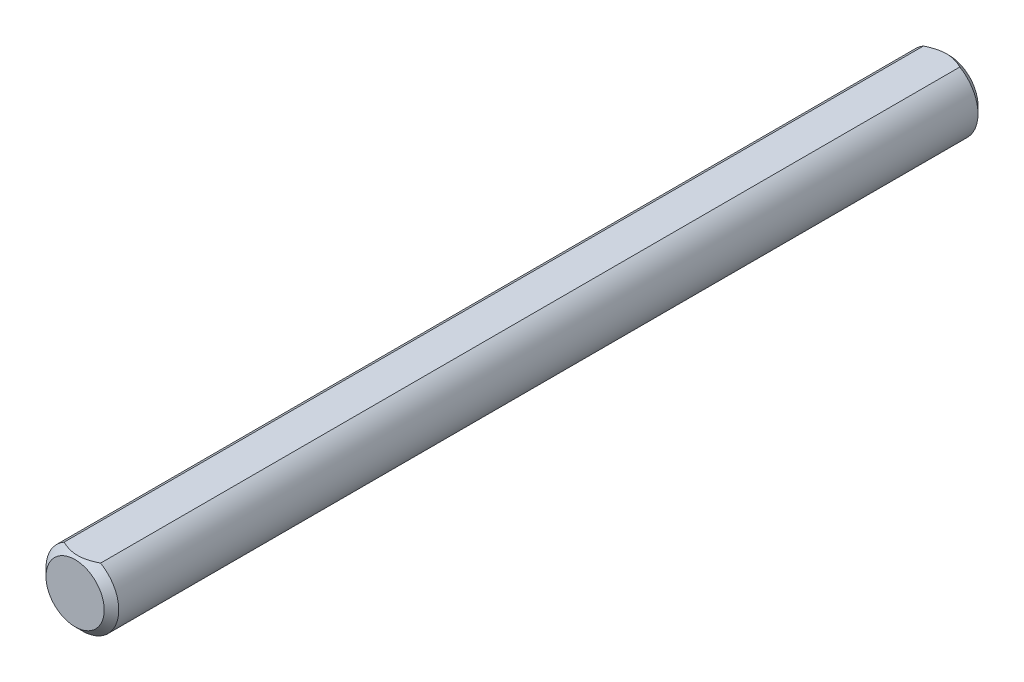
ISO-10303-21;
HEADER;
FILE_DESCRIPTION(('STEP AP214'),'2;1');
FILE_NAME('part.step','',(''),(''),'','','');
FILE_SCHEMA(('AUTOMOTIVE_DESIGN { 1 0 10303 214 1 1 1 1 }'));
ENDSEC;
DATA;
#1=APPLICATION_CONTEXT('core data for automotive mechanical design processes');
#2=APPLICATION_PROTOCOL_DEFINITION('international standard','automotive_design',2000,#1);
#3=PRODUCT_CONTEXT('',#1,'mechanical');
#4=PRODUCT('Part','Part','',(#3));
#5=PRODUCT_RELATED_PRODUCT_CATEGORY('part','',(#4));
#6=PRODUCT_DEFINITION_FORMATION('','',#4);
#7=PRODUCT_DEFINITION_CONTEXT('part definition',#1,'design');
#8=PRODUCT_DEFINITION('design','',#6,#7);
#9=PRODUCT_DEFINITION_SHAPE('','',#8);
#10=(LENGTH_UNIT() NAMED_UNIT(*) SI_UNIT(.MILLI.,.METRE.));
#11=(NAMED_UNIT(*) PLANE_ANGLE_UNIT() SI_UNIT($,.RADIAN.));
#12=(NAMED_UNIT(*) SI_UNIT($,.STERADIAN.) SOLID_ANGLE_UNIT());
#13=UNCERTAINTY_MEASURE_WITH_UNIT(LENGTH_MEASURE(1.E-05),#10,'distance_accuracy_value','');
#14=(GEOMETRIC_REPRESENTATION_CONTEXT(3) GLOBAL_UNCERTAINTY_ASSIGNED_CONTEXT((#13)) GLOBAL_UNIT_ASSIGNED_CONTEXT((#10,
#11,#12)) REPRESENTATION_CONTEXT('',''));
#15=CARTESIAN_POINT('',(0.,0.,0.));
#16=DIRECTION('',(0.,0.,1.));
#17=DIRECTION('',(1.,0.,0.));
#18=AXIS2_PLACEMENT_3D('',#15,#16,#17);
#19=CARTESIAN_POINT('',(0.,0.,76.2));
#20=DIRECTION('',(0.,0.,-1.));
#21=DIRECTION('',(-1.,0.,0.));
#22=AXIS2_PLACEMENT_3D('',#19,#20,#21);
#23=CYLINDRICAL_SURFACE('',#22,6.35);
#24=CARTESIAN_POINT('',(0.,0.,74.93));
#25=DIRECTION('',(0.,0.,1.));
#26=DIRECTION('',(1.,0.,0.));
#27=AXIS2_PLACEMENT_3D('',#24,#25,#26);
#28=CIRCLE('',#27,6.35);
#29=CARTESIAN_POINT('',(3.175,5.49926131403118,74.93));
#30=VERTEX_POINT('',#29);
#31=CARTESIAN_POINT('',(-3.175,5.49926131403118,74.93));
#32=VERTEX_POINT('',#31);
#33=EDGE_CURVE('E74',#30,#32,#28,.F.);
#34=ORIENTED_EDGE('',*,*,#33,.T.);
#35=DIRECTION('',(0.,0.,1.));
#36=VECTOR('',#35,1.);
#37=CARTESIAN_POINT('',(-3.175,5.49926131403118,-76.2));
#38=LINE('',#37,#36);
#39=CARTESIAN_POINT('',(-3.175,5.49926131403118,-74.9299999999999));
#40=VERTEX_POINT('',#39);
#41=EDGE_CURVE('E52',#40,#32,#38,.T.);
#42=ORIENTED_EDGE('',*,*,#41,.F.);
#43=CARTESIAN_POINT('',(0.,0.,-74.9299999999999));
#44=DIRECTION('',(0.,0.,1.));
#45=DIRECTION('',(1.,0.,0.));
#46=AXIS2_PLACEMENT_3D('',#43,#44,#45);
#47=CIRCLE('',#46,6.35);
#48=CARTESIAN_POINT('',(3.175,5.49926131403118,-74.9299999999999));
#49=VERTEX_POINT('',#48);
#50=EDGE_CURVE('E73',#40,#49,#47,.T.);
#51=ORIENTED_EDGE('',*,*,#50,.T.);
#52=DIRECTION('',(0.,0.,1.));
#53=VECTOR('',#52,1.);
#54=CARTESIAN_POINT('',(3.175,5.49926131403118,-76.2));
#55=LINE('',#54,#53);
#56=EDGE_CURVE('E62',#49,#30,#55,.T.);
#57=ORIENTED_EDGE('',*,*,#56,.T.);
#58=EDGE_LOOP('',(#34,#42,#51,#57));
#59=FACE_BOUND('',#58,.T.);
#60=ADVANCED_FACE('F32',(#59),#23,.T.);
#61=CARTESIAN_POINT('',(0.,0.,76.2));
#62=DIRECTION('',(0.,0.,1.));
#63=DIRECTION('',(1.,0.,0.));
#64=AXIS2_PLACEMENT_3D('',#61,#62,#63);
#65=PLANE('',#64);
#66=CARTESIAN_POINT('',(0.,0.,76.2));
#67=DIRECTION('',(0.,0.,1.));
#68=DIRECTION('',(1.,0.,0.));
#69=AXIS2_PLACEMENT_3D('',#66,#67,#68);
#70=CIRCLE('',#69,5.08000000000004);
#71=CARTESIAN_POINT('',(5.08000000000004,0.,76.2));
#72=VERTEX_POINT('',#71);
#73=EDGE_CURVE('E46',#72,#72,#70,.T.);
#74=ORIENTED_EDGE('',*,*,#73,.T.);
#75=EDGE_LOOP('',(#74));
#76=FACE_BOUND('',#75,.T.);
#77=ADVANCED_FACE('F84',(#76),#65,.T.);
#78=CARTESIAN_POINT('',(0.,0.,-76.2));
#79=DIRECTION('',(0.,0.,1.));
#80=DIRECTION('',(1.,0.,0.));
#81=AXIS2_PLACEMENT_3D('',#78,#79,#80);
#82=PLANE('',#81);
#83=CARTESIAN_POINT('',(0.,0.,-76.2));
#84=DIRECTION('',(0.,0.,1.));
#85=DIRECTION('',(1.,0.,0.));
#86=AXIS2_PLACEMENT_3D('',#83,#84,#85);
#87=CIRCLE('',#86,5.07999999999988);
#88=CARTESIAN_POINT('',(5.07999999999988,0.,-76.2));
#89=VERTEX_POINT('',#88);
#90=EDGE_CURVE('E76',#89,#89,#87,.F.);
#91=ORIENTED_EDGE('',*,*,#90,.T.);
#92=EDGE_LOOP('',(#91));
#93=FACE_BOUND('',#92,.T.);
#94=ADVANCED_FACE('F92',(#93),#82,.F.);
#95=CARTESIAN_POINT('',(0.,0.,-74.9299999999999));
#96=DIRECTION('',(0.,0.,1.));
#97=DIRECTION('',(1.,0.,0.));
#98=AXIS2_PLACEMENT_3D('',#95,#96,#97);
#99=CONICAL_SURFACE('',#98,6.35,0.785398163397445);
#100=CARTESIAN_POINT('',(-6.45792270447453,5.49926131403118,-72.7978634379674));
#101=CARTESIAN_POINT('',(-6.30123299115944,5.49926131403118,-72.9171330488199));
#102=CARTESIAN_POINT('',(-6.14368019310392,5.49926131403118,-73.0352869639139));
#103=CARTESIAN_POINT('',(-5.82650261129757,5.49926131403118,-73.2688594353726));
#104=CARTESIAN_POINT('',(-5.66687732996834,5.49926131403118,-73.3842773153237));
#105=CARTESIAN_POINT('',(-5.34404125721356,5.49926131403118,-73.6126950953359));
#106=CARTESIAN_POINT('',(-5.18081227996582,5.49926131403118,-73.7256693781113));
#107=CARTESIAN_POINT('',(-4.85160623188593,5.49926131403118,-73.9475270296315));
#108=CARTESIAN_POINT('',(-4.68562935411628,5.49926131403118,-74.0564106840339));
#109=CARTESIAN_POINT('',(-4.34045504917425,5.49926131403118,-74.2755311755331));
#110=CARTESIAN_POINT('',(-4.16106068889063,5.49926131403118,-74.3854593569187));
#111=CARTESIAN_POINT('',(-3.7980720381419,5.49926131403118,-74.5982637689522));
#112=CARTESIAN_POINT('',(-3.61447707081218,5.49926131403118,-74.7011388522732));
#113=CARTESIAN_POINT('',(-3.24307520421854,5.49926131403118,-74.8976296093296));
#114=CARTESIAN_POINT('',(-3.05528281776388,5.49926131403118,-74.9912725000992));
#115=CARTESIAN_POINT('',(-2.67449413212762,5.49926131403118,-75.1672016309353));
#116=CARTESIAN_POINT('',(-2.481500281839,5.49926131403118,-75.2494931074317));
#117=CARTESIAN_POINT('',(-2.10729485559333,5.49926131403118,-75.3931128742391));
#118=CARTESIAN_POINT('',(-1.92655285319339,5.49926131403118,-75.4556520873093));
#119=CARTESIAN_POINT('',(-1.56060746830592,5.49926131403118,-75.5662463753379));
#120=CARTESIAN_POINT('',(-1.37540378987201,5.49926131403118,-75.6143004866158));
#121=CARTESIAN_POINT('',(-1.00478287011043,5.49926131403118,-75.6925765793985));
#122=CARTESIAN_POINT('',(-0.819432918251041,5.49926131403118,-75.7231119010612));
#123=CARTESIAN_POINT('',(-0.4466126334182,5.49926131403118,-75.7657376924936));
#124=CARTESIAN_POINT('',(-0.259142702617791,5.49926131403118,-75.7778316034818));
#125=CARTESIAN_POINT('',(0.108671411643353,5.49926131403118,-75.7826189402792));
#126=CARTESIAN_POINT('',(0.289006118135223,5.49926131403118,-75.776056061745));
#127=CARTESIAN_POINT('',(0.648191454151037,5.49926131403118,-75.7455636546485));
#128=CARTESIAN_POINT('',(0.827041941701068,5.49926131403118,-75.7216324836442));
#129=CARTESIAN_POINT('',(1.18499073986413,5.49926131403118,-75.6573226270666));
#130=CARTESIAN_POINT('',(1.3640371167535,5.49926131403118,-75.6166595801062));
#131=CARTESIAN_POINT('',(1.71821198555325,5.49926131403118,-75.5210919760376));
#132=CARTESIAN_POINT('',(1.89334075993966,5.49926131403118,-75.4661884493483));
#133=CARTESIAN_POINT('',(2.2527479624495,5.49926131403118,-75.339774305195));
#134=CARTESIAN_POINT('',(2.43668654317977,5.49926131403118,-75.2673077206412));
#135=CARTESIAN_POINT('',(2.79980826463382,5.49926131403118,-75.1112154454959));
#136=CARTESIAN_POINT('',(2.97898917705066,5.49926131403118,-75.027584632808));
#137=CARTESIAN_POINT('',(3.33345739278366,5.49926131403118,-74.8511503888189));
#138=CARTESIAN_POINT('',(3.50873036744885,5.49926131403118,-74.7583184027762));
#139=CARTESIAN_POINT('',(3.85525100497096,5.49926131403118,-74.565529526063));
#140=CARTESIAN_POINT('',(4.02649929298666,5.49926131403118,-74.4655737517953));
#141=CARTESIAN_POINT('',(4.35709979473904,5.49926131403118,-74.2650304451062));
#142=CARTESIAN_POINT('',(4.51662089765094,5.49926131403118,-74.1647198605766));
#143=CARTESIAN_POINT('',(4.83292342020408,5.49926131403118,-73.9598556929713));
#144=CARTESIAN_POINT('',(4.9897046319749,5.49926131403118,-73.855301789945));
#145=CARTESIAN_POINT('',(5.29961944937069,5.49926131403118,-73.6435664598185));
#146=CARTESIAN_POINT('',(5.45277229179859,5.49926131403118,-73.5364130883871));
#147=CARTESIAN_POINT('',(5.75698104722316,5.49926131403118,-73.3192540752232));
#148=CARTESIAN_POINT('',(5.90803752602418,5.49926131403118,-73.2092492270257));
#149=CARTESIAN_POINT('',(6.05821541939244,5.49926131403118,-73.098077911165));
#150=B_SPLINE_CURVE_WITH_KNOTS('',3,(#100,#101,#102,#103,#104,#105,#106,#107,#108,#109,#110,
#111,#112,#113,#114,#115,#116,#117,#118,#119,#120,#121,#122,#123,#124,#125,#126,#127,#128,#129,
#130,#131,#132,#133,#134,#135,#136,#137,#138,#139,#140,#141,#142,#143,#144,#145,#146,#147,#148,
#149),.UNSPECIFIED.,.F.,.F.,(4,2,2,2,2,2,2,2,2,2,2,2,2,2,2,2,2,2,2,2,2,2,2,2,4),(0.,
0.590766898542407,1.18167835699757,1.77716174324589,2.37260346798137,3.00366300190785,
3.63482494787114,4.26406676088063,4.8930173256677,5.46628528877689,6.03959138246083,
6.60229516021666,7.16489392302469,7.70538452085403,8.24592623712791,8.79606110707211,
9.34615618122158,9.93879417089743,10.5317050006602,11.1265171776385,11.721236342869,
12.2864740480173,12.8517544521382,13.4124674788021,13.973026105745),.UNSPECIFIED.);
#151=EDGE_CURVE('E57',#49,#40,#150,.F.);
#152=ORIENTED_EDGE('',*,*,#151,.F.);
#153=ORIENTED_EDGE('',*,*,#50,.F.);
#154=EDGE_LOOP('',(#152,#153));
#155=FACE_BOUND('',#154,.T.);
#156=ORIENTED_EDGE('',*,*,#90,.F.);
#157=EDGE_LOOP('',(#156));
#158=FACE_BOUND('',#157,.T.);
#159=ADVANCED_FACE('F71',(#155,#158),#99,.T.);
#160=CARTESIAN_POINT('',(0.,0.,76.2));
#161=DIRECTION('',(0.,0.,-1.));
#162=DIRECTION('',(-1.,0.,0.));
#163=AXIS2_PLACEMENT_3D('',#160,#161,#162);
#164=CONICAL_SURFACE('',#163,5.08000000000004,0.785398163397445);
#165=CARTESIAN_POINT('',(-6.4579227044746,5.49926131403118,72.7978634379675));
#166=CARTESIAN_POINT('',(-6.30123299115951,5.49926131403118,72.91713304882));
#167=CARTESIAN_POINT('',(-6.14368019310399,5.49926131403118,73.0352869639141));
#168=CARTESIAN_POINT('',(-5.82650261129765,5.49926131403118,73.2688594353727));
#169=CARTESIAN_POINT('',(-5.66687732996841,5.49926131403118,73.3842773153238));
#170=CARTESIAN_POINT('',(-5.34404125721363,5.49926131403118,73.612695095336));
#171=CARTESIAN_POINT('',(-5.18081227996589,5.49926131403118,73.7256693781115));
#172=CARTESIAN_POINT('',(-4.851606231886,5.49926131403118,73.9475270296317));
#173=CARTESIAN_POINT('',(-4.68562935411634,5.49926131403118,74.056410684034));
#174=CARTESIAN_POINT('',(-4.34045504917431,5.49926131403118,74.2755311755333));
#175=CARTESIAN_POINT('',(-4.16106068889069,5.49926131403118,74.3854593569188));
#176=CARTESIAN_POINT('',(-3.79807203814195,5.49926131403118,74.5982637689524));
#177=CARTESIAN_POINT('',(-3.61447707081222,5.49926131403118,74.7011388522733));
#178=CARTESIAN_POINT('',(-3.24307520421859,5.49926131403118,74.8976296093297));
#179=CARTESIAN_POINT('',(-3.05528281776392,5.49926131403118,74.9912725000993));
#180=CARTESIAN_POINT('',(-2.67449413212766,5.49926131403118,75.1672016309354));
#181=CARTESIAN_POINT('',(-2.48150028183904,5.49926131403118,75.2494931074319));
#182=CARTESIAN_POINT('',(-2.10729485559336,5.49926131403118,75.3931128742392));
#183=CARTESIAN_POINT('',(-1.92655285319342,5.49926131403118,75.4556520873095));
#184=CARTESIAN_POINT('',(-1.56060746830595,5.49926131403118,75.5662463753381));
#185=CARTESIAN_POINT('',(-1.37540378987204,5.49926131403118,75.614300486616));
#186=CARTESIAN_POINT('',(-1.00478287011046,5.49926131403118,75.6925765793986));
#187=CARTESIAN_POINT('',(-0.819432918251068,5.49926131403118,75.7231119010614));
#188=CARTESIAN_POINT('',(-0.446612633418223,5.49926131403118,75.7657376924937));
#189=CARTESIAN_POINT('',(-0.259142702617814,5.49926131403118,75.7778316034819));
#190=CARTESIAN_POINT('',(0.108671411643332,5.49926131403118,75.7826189402794));
#191=CARTESIAN_POINT('',(0.289006118135203,5.49926131403118,75.7760560617452));
#192=CARTESIAN_POINT('',(0.64819145415102,5.49926131403118,75.7455636546487));
#193=CARTESIAN_POINT('',(0.827041941701053,5.49926131403118,75.7216324836444));
#194=CARTESIAN_POINT('',(1.18499073986412,5.49926131403118,75.6573226270668));
#195=CARTESIAN_POINT('',(1.36403711675348,5.49926131403118,75.6166595801063));
#196=CARTESIAN_POINT('',(1.71821198555323,5.49926131403118,75.5210919760378));
#197=CARTESIAN_POINT('',(1.89334075993965,5.49926131403118,75.4661884493485));
#198=CARTESIAN_POINT('',(2.25274796244949,5.49926131403118,75.3397743051952));
#199=CARTESIAN_POINT('',(2.43668654317976,5.49926131403118,75.2673077206414));
#200=CARTESIAN_POINT('',(2.7998082646338,5.49926131403118,75.1112154454961));
#201=CARTESIAN_POINT('',(2.97898917705065,5.49926131403118,75.0275846328082));
#202=CARTESIAN_POINT('',(3.33345739278364,5.49926131403118,74.8511503888191));
#203=CARTESIAN_POINT('',(3.50873036744882,5.49926131403118,74.7583184027764));
#204=CARTESIAN_POINT('',(3.85525100497092,5.49926131403118,74.5655295260632));
#205=CARTESIAN_POINT('',(4.02649929298662,5.49926131403118,74.4655737517954));
#206=CARTESIAN_POINT('',(4.357099794739,5.49926131403118,74.2650304451064));
#207=CARTESIAN_POINT('',(4.51662089765091,5.49926131403118,74.1647198605768));
#208=CARTESIAN_POINT('',(4.83292342020405,5.49926131403118,73.9598556929715));
#209=CARTESIAN_POINT('',(4.98970463197486,5.49926131403118,73.8553017899452));
#210=CARTESIAN_POINT('',(5.29961944937065,5.49926131403118,73.6435664598186));
#211=CARTESIAN_POINT('',(5.45277229179854,5.49926131403118,73.5364130883873));
#212=CARTESIAN_POINT('',(5.75698104722311,5.49926131403118,73.3192540752234));
#213=CARTESIAN_POINT('',(5.90803752602414,5.49926131403118,73.2092492270259));
#214=CARTESIAN_POINT('',(6.0582154193924,5.49926131403118,73.0980779111652));
#215=B_SPLINE_CURVE_WITH_KNOTS('',3,(#165,#166,#167,#168,#169,#170,#171,#172,#173,#174,#175,
#176,#177,#178,#179,#180,#181,#182,#183,#184,#185,#186,#187,#188,#189,#190,#191,#192,#193,#194,
#195,#196,#197,#198,#199,#200,#201,#202,#203,#204,#205,#206,#207,#208,#209,#210,#211,#212,#213,
#214),.UNSPECIFIED.,.F.,.F.,(4,2,2,2,2,2,2,2,2,2,2,2,2,2,2,2,2,2,2,2,2,2,2,2,4),(0.,
0.590766898542406,1.18167835699757,1.77716174324589,2.37260346798138,3.00366300190788,
3.63482494787119,4.26406676088068,4.89301732566776,5.46628528877695,6.0395913824609,
6.60229516021673,7.16489392302476,7.70538452085411,8.24592623712799,8.79606110707219,
9.34615618122166,9.93879417089751,10.5317050006603,11.1265171776386,11.7212363428691,
12.2864740480173,12.8517544521382,13.4124674788021,13.973026105745),.UNSPECIFIED.);
#216=EDGE_CURVE('E11',#32,#30,#215,.T.);
#217=ORIENTED_EDGE('',*,*,#216,.F.);
#218=ORIENTED_EDGE('',*,*,#33,.F.);
#219=EDGE_LOOP('',(#217,#218));
#220=FACE_BOUND('',#219,.T.);
#221=ORIENTED_EDGE('',*,*,#73,.F.);
#222=EDGE_LOOP('',(#221));
#223=FACE_BOUND('',#222,.T.);
#224=ADVANCED_FACE('F34',(#220,#223),#164,.T.);
#225=CARTESIAN_POINT('',(-3.175,5.49926131403118,-76.2));
#226=DIRECTION('',(0.,-1.,0.));
#227=DIRECTION('',(0.,0.,-1.));
#228=AXIS2_PLACEMENT_3D('',#225,#226,#227);
#229=PLANE('',#228);
#230=ORIENTED_EDGE('',*,*,#151,.T.);
#231=ORIENTED_EDGE('',*,*,#41,.T.);
#232=ORIENTED_EDGE('',*,*,#216,.T.);
#233=ORIENTED_EDGE('',*,*,#56,.F.);
#234=EDGE_LOOP('',(#230,#231,#232,#233));
#235=FACE_BOUND('',#234,.T.);
#236=ADVANCED_FACE('F63',(#235),#229,.F.);
#237=CLOSED_SHELL('',(#60,#77,#94,#159,#224,#236));
#238=MANIFOLD_SOLID_BREP('B2',#237);
#239=ADVANCED_BREP_SHAPE_REPRESENTATION('',(#18,#238),#14);
#240=SHAPE_DEFINITION_REPRESENTATION(#9,#239);
ENDSEC;
END-ISO-10303-21;
